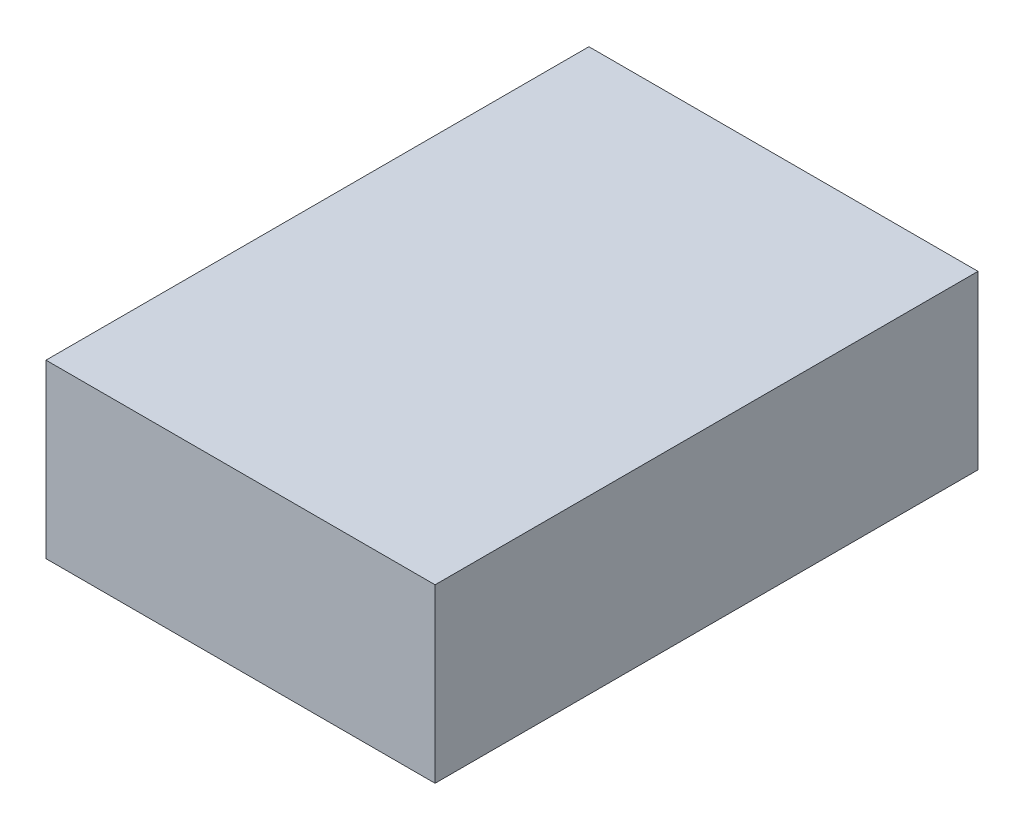
ISO-10303-21;
HEADER;
FILE_DESCRIPTION(('STEP AP214'),'2;1');
FILE_NAME('part.step','',(''),(''),'','','');
FILE_SCHEMA(('AUTOMOTIVE_DESIGN { 1 0 10303 214 1 1 1 1 }'));
ENDSEC;
DATA;
#1=APPLICATION_CONTEXT('core data for automotive mechanical design processes');
#2=APPLICATION_PROTOCOL_DEFINITION('international standard','automotive_design',2000,#1);
#3=PRODUCT_CONTEXT('',#1,'mechanical');
#4=PRODUCT('Part','Part','',(#3));
#5=PRODUCT_RELATED_PRODUCT_CATEGORY('part','',(#4));
#6=PRODUCT_DEFINITION_FORMATION('','',#4);
#7=PRODUCT_DEFINITION_CONTEXT('part definition',#1,'design');
#8=PRODUCT_DEFINITION('design','',#6,#7);
#9=PRODUCT_DEFINITION_SHAPE('','',#8);
#10=(LENGTH_UNIT() NAMED_UNIT(*) SI_UNIT(.MILLI.,.METRE.));
#11=(NAMED_UNIT(*) PLANE_ANGLE_UNIT() SI_UNIT($,.RADIAN.));
#12=(NAMED_UNIT(*) SI_UNIT($,.STERADIAN.) SOLID_ANGLE_UNIT());
#13=UNCERTAINTY_MEASURE_WITH_UNIT(LENGTH_MEASURE(1.E-05),#10,'distance_accuracy_value','');
#14=(GEOMETRIC_REPRESENTATION_CONTEXT(3) GLOBAL_UNCERTAINTY_ASSIGNED_CONTEXT((#13)) GLOBAL_UNIT_ASSIGNED_CONTEXT((#10,
#11,#12)) REPRESENTATION_CONTEXT('',''));
#15=CARTESIAN_POINT('',(0.,0.,0.));
#16=DIRECTION('',(0.,0.,1.));
#17=DIRECTION('',(1.,0.,0.));
#18=AXIS2_PLACEMENT_3D('',#15,#16,#17);
#19=CARTESIAN_POINT('',(-27.305,12.065,-38.1));
#20=DIRECTION('',(1.,0.,0.));
#21=DIRECTION('',(0.,0.,-1.));
#22=AXIS2_PLACEMENT_3D('',#19,#20,#21);
#23=PLANE('',#22);
#24=DIRECTION('',(0.,0.,1.));
#25=VECTOR('',#24,1.);
#26=CARTESIAN_POINT('',(-27.305,-12.065,-38.1));
#27=LINE('',#26,#25);
#28=CARTESIAN_POINT('',(-27.305,-12.065,-38.1));
#29=VERTEX_POINT('',#28);
#30=CARTESIAN_POINT('',(-27.305,-12.065,38.1));
#31=VERTEX_POINT('',#30);
#32=EDGE_CURVE('E107',#29,#31,#27,.T.);
#33=ORIENTED_EDGE('',*,*,#32,.T.);
#34=DIRECTION('',(0.,-1.,0.));
#35=VECTOR('',#34,1.);
#36=CARTESIAN_POINT('',(-27.305,12.065,38.1));
#37=LINE('',#36,#35);
#38=CARTESIAN_POINT('',(-27.305,12.065,38.1));
#39=VERTEX_POINT('',#38);
#40=EDGE_CURVE('E11',#39,#31,#37,.T.);
#41=ORIENTED_EDGE('',*,*,#40,.F.);
#42=DIRECTION('',(0.,0.,1.));
#43=VECTOR('',#42,1.);
#44=CARTESIAN_POINT('',(-27.305,12.065,-38.1));
#45=LINE('',#44,#43);
#46=CARTESIAN_POINT('',(-27.305,12.065,-38.1));
#47=VERTEX_POINT('',#46);
#48=EDGE_CURVE('E91',#47,#39,#45,.T.);
#49=ORIENTED_EDGE('',*,*,#48,.F.);
#50=DIRECTION('',(0.,-1.,0.));
#51=VECTOR('',#50,1.);
#52=CARTESIAN_POINT('',(-27.305,12.065,-38.1));
#53=LINE('',#52,#51);
#54=EDGE_CURVE('E103',#47,#29,#53,.T.);
#55=ORIENTED_EDGE('',*,*,#54,.T.);
#56=EDGE_LOOP('',(#33,#41,#49,#55));
#57=FACE_BOUND('',#56,.T.);
#58=ADVANCED_FACE('F39',(#57),#23,.F.);
#59=CARTESIAN_POINT('',(-27.305,12.065,38.1));
#60=DIRECTION('',(0.,0.,-1.));
#61=DIRECTION('',(-1.,0.,0.));
#62=AXIS2_PLACEMENT_3D('',#59,#60,#61);
#63=PLANE('',#62);
#64=DIRECTION('',(1.,0.,0.));
#65=VECTOR('',#64,1.);
#66=CARTESIAN_POINT('',(-27.305,-12.065,38.1));
#67=LINE('',#66,#65);
#68=CARTESIAN_POINT('',(27.305,-12.065,38.1));
#69=VERTEX_POINT('',#68);
#70=EDGE_CURVE('E96',#31,#69,#67,.T.);
#71=ORIENTED_EDGE('',*,*,#70,.T.);
#72=DIRECTION('',(0.,-1.,0.));
#73=VECTOR('',#72,1.);
#74=CARTESIAN_POINT('',(27.305,12.065,38.1));
#75=LINE('',#74,#73);
#76=CARTESIAN_POINT('',(27.305,12.065,38.1));
#77=VERTEX_POINT('',#76);
#78=EDGE_CURVE('E48',#77,#69,#75,.T.);
#79=ORIENTED_EDGE('',*,*,#78,.F.);
#80=DIRECTION('',(1.,0.,0.));
#81=VECTOR('',#80,1.);
#82=CARTESIAN_POINT('',(-27.305,12.065,38.1));
#83=LINE('',#82,#81);
#84=EDGE_CURVE('E86',#39,#77,#83,.T.);
#85=ORIENTED_EDGE('',*,*,#84,.F.);
#86=ORIENTED_EDGE('',*,*,#40,.T.);
#87=EDGE_LOOP('',(#71,#79,#85,#86));
#88=FACE_BOUND('',#87,.T.);
#89=ADVANCED_FACE('F95',(#88),#63,.F.);
#90=CARTESIAN_POINT('',(27.305,12.065,-38.1));
#91=DIRECTION('',(-1.,0.,0.));
#92=DIRECTION('',(0.,0.,1.));
#93=AXIS2_PLACEMENT_3D('',#90,#91,#92);
#94=PLANE('',#93);
#95=DIRECTION('',(0.,0.,-1.));
#96=VECTOR('',#95,1.);
#97=CARTESIAN_POINT('',(27.305,-12.065,-38.1));
#98=LINE('',#97,#96);
#99=CARTESIAN_POINT('',(27.305,-12.065,-38.1));
#100=VERTEX_POINT('',#99);
#101=EDGE_CURVE('E73',#69,#100,#98,.T.);
#102=ORIENTED_EDGE('',*,*,#101,.T.);
#103=DIRECTION('',(0.,-1.,0.));
#104=VECTOR('',#103,1.);
#105=CARTESIAN_POINT('',(27.305,12.065,-38.1));
#106=LINE('',#105,#104);
#107=CARTESIAN_POINT('',(27.305,12.065,-38.1));
#108=VERTEX_POINT('',#107);
#109=EDGE_CURVE('E98',#108,#100,#106,.T.);
#110=ORIENTED_EDGE('',*,*,#109,.F.);
#111=DIRECTION('',(0.,0.,-1.));
#112=VECTOR('',#111,1.);
#113=CARTESIAN_POINT('',(27.305,12.065,-38.1));
#114=LINE('',#113,#112);
#115=EDGE_CURVE('E89',#77,#108,#114,.T.);
#116=ORIENTED_EDGE('',*,*,#115,.F.);
#117=ORIENTED_EDGE('',*,*,#78,.T.);
#118=EDGE_LOOP('',(#102,#110,#116,#117));
#119=FACE_BOUND('',#118,.T.);
#120=ADVANCED_FACE('F99',(#119),#94,.F.);
#121=CARTESIAN_POINT('',(-27.305,12.065,-38.1));
#122=DIRECTION('',(0.,0.,1.));
#123=DIRECTION('',(1.,0.,0.));
#124=AXIS2_PLACEMENT_3D('',#121,#122,#123);
#125=PLANE('',#124);
#126=DIRECTION('',(-1.,0.,0.));
#127=VECTOR('',#126,1.);
#128=CARTESIAN_POINT('',(-27.305,-12.065,-38.1));
#129=LINE('',#128,#127);
#130=EDGE_CURVE('E79',#100,#29,#129,.T.);
#131=ORIENTED_EDGE('',*,*,#130,.T.);
#132=ORIENTED_EDGE('',*,*,#54,.F.);
#133=DIRECTION('',(-1.,0.,0.));
#134=VECTOR('',#133,1.);
#135=CARTESIAN_POINT('',(-27.305,12.065,-38.1));
#136=LINE('',#135,#134);
#137=EDGE_CURVE('E56',#108,#47,#136,.T.);
#138=ORIENTED_EDGE('',*,*,#137,.F.);
#139=ORIENTED_EDGE('',*,*,#109,.T.);
#140=EDGE_LOOP('',(#131,#132,#138,#139));
#141=FACE_BOUND('',#140,.T.);
#142=ADVANCED_FACE('F120',(#141),#125,.F.);
#143=CARTESIAN_POINT('',(0.,12.065,0.));
#144=DIRECTION('',(0.,1.,0.));
#145=DIRECTION('',(0.,0.,1.));
#146=AXIS2_PLACEMENT_3D('',#143,#144,#145);
#147=PLANE('',#146);
#148=ORIENTED_EDGE('',*,*,#48,.T.);
#149=ORIENTED_EDGE('',*,*,#84,.T.);
#150=ORIENTED_EDGE('',*,*,#115,.T.);
#151=ORIENTED_EDGE('',*,*,#137,.T.);
#152=EDGE_LOOP('',(#148,#149,#150,#151));
#153=FACE_BOUND('',#152,.T.);
#154=ADVANCED_FACE('F87',(#153),#147,.T.);
#155=CARTESIAN_POINT('',(0.,-12.065,0.));
#156=DIRECTION('',(0.,1.,0.));
#157=DIRECTION('',(0.,0.,1.));
#158=AXIS2_PLACEMENT_3D('',#155,#156,#157);
#159=PLANE('',#158);
#160=ORIENTED_EDGE('',*,*,#32,.F.);
#161=ORIENTED_EDGE('',*,*,#130,.F.);
#162=ORIENTED_EDGE('',*,*,#101,.F.);
#163=ORIENTED_EDGE('',*,*,#70,.F.);
#164=EDGE_LOOP('',(#160,#161,#162,#163));
#165=FACE_BOUND('',#164,.T.);
#166=ADVANCED_FACE('F123',(#165),#159,.F.);
#167=CLOSED_SHELL('',(#58,#89,#120,#142,#154,#166));
#168=MANIFOLD_SOLID_BREP('B2',#167);
#169=ADVANCED_BREP_SHAPE_REPRESENTATION('',(#18,#168),#14);
#170=SHAPE_DEFINITION_REPRESENTATION(#9,#169);
ENDSEC;
END-ISO-10303-21;
